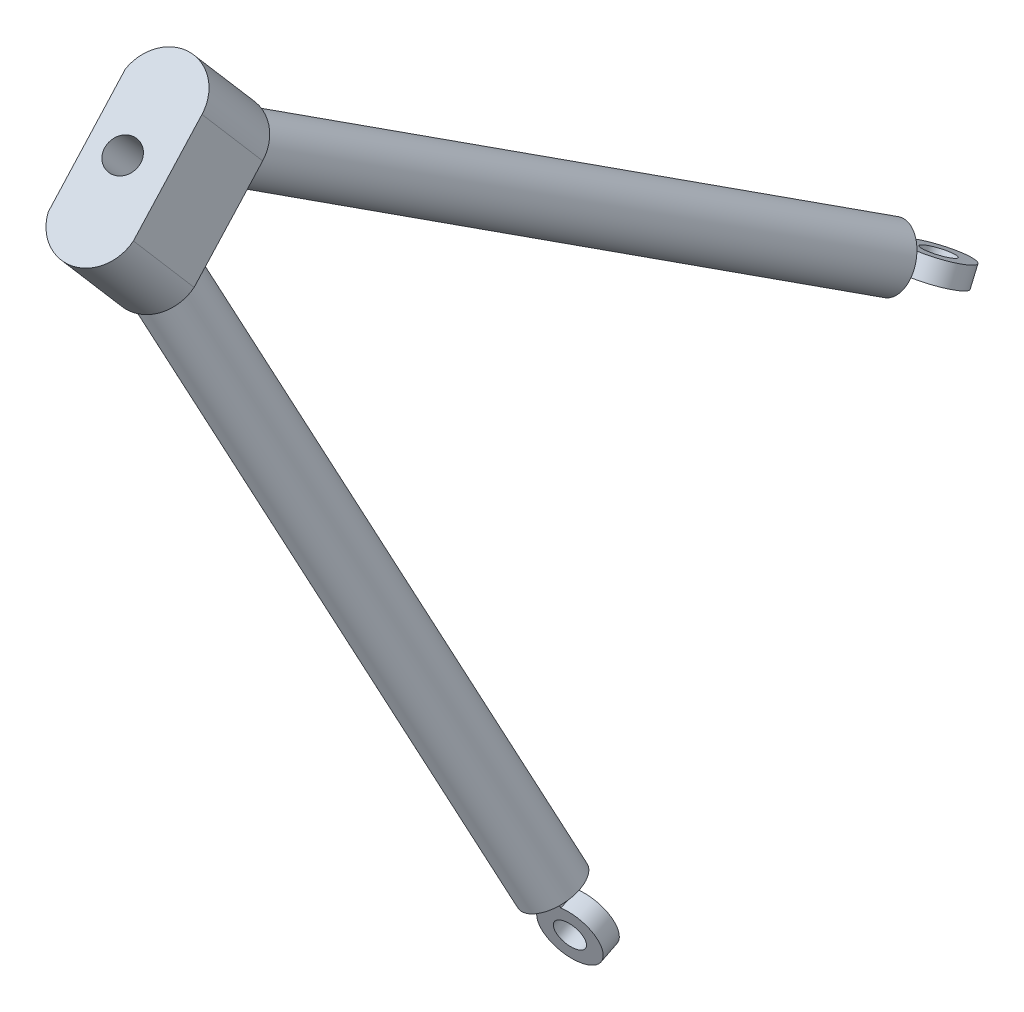
ISO-10303-21;
HEADER;
FILE_DESCRIPTION(('STEP AP214'),'2;1');
FILE_NAME('part.step','',(''),(''),'','','');
FILE_SCHEMA(('AUTOMOTIVE_DESIGN { 1 0 10303 214 1 1 1 1 }'));
ENDSEC;
DATA;
#1=APPLICATION_CONTEXT('core data for automotive mechanical design processes');
#2=APPLICATION_PROTOCOL_DEFINITION('international standard','automotive_design',2000,#1);
#3=PRODUCT_CONTEXT('',#1,'mechanical');
#4=PRODUCT('Part','Part','',(#3));
#5=PRODUCT_RELATED_PRODUCT_CATEGORY('part','',(#4));
#6=PRODUCT_DEFINITION_FORMATION('','',#4);
#7=PRODUCT_DEFINITION_CONTEXT('part definition',#1,'design');
#8=PRODUCT_DEFINITION('design','',#6,#7);
#9=PRODUCT_DEFINITION_SHAPE('','',#8);
#10=(LENGTH_UNIT() NAMED_UNIT(*) SI_UNIT(.MILLI.,.METRE.));
#11=(NAMED_UNIT(*) PLANE_ANGLE_UNIT() SI_UNIT($,.RADIAN.));
#12=(NAMED_UNIT(*) SI_UNIT($,.STERADIAN.) SOLID_ANGLE_UNIT());
#13=UNCERTAINTY_MEASURE_WITH_UNIT(LENGTH_MEASURE(1.E-05),#10,'distance_accuracy_value','');
#14=(GEOMETRIC_REPRESENTATION_CONTEXT(3) GLOBAL_UNCERTAINTY_ASSIGNED_CONTEXT((#13)) GLOBAL_UNIT_ASSIGNED_CONTEXT((#10,
#11,#12)) REPRESENTATION_CONTEXT('',''));
#15=CARTESIAN_POINT('',(0.,0.,0.));
#16=DIRECTION('',(0.,0.,1.));
#17=DIRECTION('',(1.,0.,0.));
#18=AXIS2_PLACEMENT_3D('',#15,#16,#17);
#19=CARTESIAN_POINT('',(64.1066183327884,286.099935377502,168.11116611111));
#20=DIRECTION('',(-0.037673906148432,-0.778948907408393,-0.625954692004773));
#21=DIRECTION('',(0.,0.626399381438984,-0.779502286675837));
#22=AXIS2_PLACEMENT_3D('',#19,#20,#21);
#23=PLANE('',#22);
#24=CARTESIAN_POINT('',(-121.852419430735,339.457254108478,112.90457970323));
#25=DIRECTION('',(-0.037673906148432,-0.778948907408393,-0.625954692004773));
#26=DIRECTION('',(-0.993413930876286,-0.0386367224667163,0.107870133113649));
#27=AXIS2_PLACEMENT_3D('',#24,#25,#26);
#28=ELLIPSE('',#27,8.43593846476446,8.00000000000001);
#29=CARTESIAN_POINT('',(-130.232798221647,339.131317095268,113.814565508363));
#30=VERTEX_POINT('',#29);
#31=EDGE_CURVE('E182',#30,#30,#28,.T.);
#32=ORIENTED_EDGE('',*,*,#31,.T.);
#33=EDGE_LOOP('',(#32));
#34=FACE_BOUND('',#33,.T.);
#35=DIRECTION('',(0.1082101600426,-0.62589600040606,0.772363099804265));
#36=VECTOR('',#35,1.);
#37=CARTESIAN_POINT('',(-148.451309490906,396.444612421055,43.5894088768372));
#38=LINE('',#37,#36);
#39=CARTESIAN_POINT('',(-141.725842387964,357.54398646378,91.5932434263382));
#40=VERTEX_POINT('',#39);
#41=CARTESIAN_POINT('',(-135.248163738386,320.076588235273,137.828457932577));
#42=VERTEX_POINT('',#41);
#43=EDGE_CURVE('E292',#40,#42,#38,.T.);
#44=ORIENTED_EDGE('',*,*,#43,.T.);
#45=CARTESIAN_POINT('',(-97.3381940576362,323.025360728805,131.877292777245));
#46=CARTESIAN_POINT('',(-97.3381937393744,322.855899519819,132.088173234382));
#47=CARTESIAN_POINT('',(-97.3438139305175,322.686621775132,132.299163663103));
#48=CARTESIAN_POINT('',(-97.366279465957,322.348694154114,132.721038790843));
#49=CARTESIAN_POINT('',(-97.3831244578764,322.180044258239,132.931923492974));
#50=CARTESIAN_POINT('',(-97.4504624258511,321.675493761683,133.563847731842));
#51=CARTESIAN_POINT('',(-97.5177584105921,321.340909510328,133.984260491748));
#52=CARTESIAN_POINT('',(-97.696718273175,320.677702676251,134.820337547391));
#53=CARTESIAN_POINT('',(-97.8083833724261,320.349080257909,135.236001712083));
#54=CARTESIAN_POINT('',(-98.0085155166511,319.862415644835,135.853660838511));
#55=CARTESIAN_POINT('',(-98.080668844742,319.701232635498,136.058582422078));
#56=CARTESIAN_POINT('',(-98.235753396477,319.381162487171,136.466217250028));
#57=CARTESIAN_POINT('',(-98.3186873001898,319.222275930034,136.668929931647));
#58=CARTESIAN_POINT('',(-98.5834034146772,318.749591008868,137.27307955745));
#59=CARTESIAN_POINT('',(-98.7811448469471,318.439658465263,137.670666334179));
#60=CARTESIAN_POINT('',(-99.2177842181535,317.832390328204,138.452641082207));
#61=CARTESIAN_POINT('',(-99.4566821580555,317.535054735047,138.837029053195));
#62=CARTESIAN_POINT('',(-99.8445973545878,317.100075558855,139.401671892785));
#63=CARTESIAN_POINT('',(-99.9788559838456,316.956896302825,139.587927181762));
#64=CARTESIAN_POINT('',(-100.256972869585,316.6744803494,139.956109337357));
#65=CARTESIAN_POINT('',(-100.400828727979,316.535242679402,140.138037269965));
#66=CARTESIAN_POINT('',(-100.846508074405,316.123730775573,140.676953638916));
#67=CARTESIAN_POINT('',(-101.162468123967,315.857629858021,141.027110720636));
#68=CARTESIAN_POINT('',(-101.829738613724,315.343899528108,141.706566231438));
#69=CARTESIAN_POINT('',(-102.181049099533,315.096270139581,142.035864633605));
#70=CARTESIAN_POINT('',(-102.916638965089,314.621147625528,142.671387798216));
#71=CARTESIAN_POINT('',(-103.300918393683,314.393654529835,142.977612526473));
#72=CARTESIAN_POINT('',(-104.099779146479,313.960388726496,143.564856513698));
#73=CARTESIAN_POINT('',(-104.514360455677,313.754616008093,143.845875785148));
#74=CARTESIAN_POINT('',(-105.370964524748,313.366208971872,144.38077209965));
#75=CARTESIAN_POINT('',(-105.812987271141,313.183574642686,144.634649156037));
#76=CARTESIAN_POINT('',(-106.721420443941,312.842706620628,145.113506497112));
#77=CARTESIAN_POINT('',(-107.187830874477,312.684472931888,145.338486776906));
#78=CARTESIAN_POINT('',(-108.141818030109,312.393498932255,145.757996854905));
#79=CARTESIAN_POINT('',(-108.629394758435,312.260758625252,145.952526648463));
#80=CARTESIAN_POINT('',(-109.622346530586,312.021688361731,146.309791951038));
#81=CARTESIAN_POINT('',(-110.127721573427,311.915358403755,146.472527461811));
#82=CARTESIAN_POINT('',(-111.152779234605,311.729843265186,146.765080170432));
#83=CARTESIAN_POINT('',(-111.67246185234,311.650658083452,146.894897369663));
#84=CARTESIAN_POINT('',(-112.722545104743,311.5199794474,147.120716778766));
#85=CARTESIAN_POINT('',(-113.252945739657,311.468485993715,147.216718987863));
#86=CARTESIAN_POINT('',(-114.320801395158,311.393546494499,147.374245300935));
#87=CARTESIAN_POINT('',(-114.858256415719,311.370100448862,147.43576940504));
#88=CARTESIAN_POINT('',(-115.936508481097,311.351417714111,147.523914543405));
#89=CARTESIAN_POINT('',(-116.477305525804,311.356181024073,147.550535578809));
#90=CARTESIAN_POINT('',(-117.558506265147,311.393884098147,147.568690705643));
#91=CARTESIAN_POINT('',(-118.098909959756,311.426823864213,147.56022479464));
#92=CARTESIAN_POINT('',(-119.175591310538,311.520652334713,147.508264496499));
#93=CARTESIAN_POINT('',(-119.711868966236,311.581541042373,147.46477010532));
#94=CARTESIAN_POINT('',(-120.776593802281,311.730846800189,147.343053287239));
#95=CARTESIAN_POINT('',(-121.305040984977,311.819263842083,147.264830870761));
#96=CARTESIAN_POINT('',(-122.350454678671,312.023015507611,147.074198351528));
#97=CARTESIAN_POINT('',(-122.86742119483,312.138350119137,146.961788264149));
#98=CARTESIAN_POINT('',(-123.886303594109,312.395140456642,146.703556678045));
#99=CARTESIAN_POINT('',(-124.388219459171,312.536596213956,146.557735139238));
#100=CARTESIAN_POINT('',(-125.373533874269,312.844651931977,146.233687688579));
#101=CARTESIAN_POINT('',(-125.856932392464,313.011251935919,146.055461721009));
#102=CARTESIAN_POINT('',(-126.801870073014,313.368444424818,145.667837491062));
#103=CARTESIAN_POINT('',(-127.263409336755,313.559036798482,145.458439373285));
#104=CARTESIAN_POINT('',(-128.16143991183,313.962896718961,145.00991821387));
#105=CARTESIAN_POINT('',(-128.597931383386,314.176164120706,144.770795362403));
#106=CARTESIAN_POINT('',(-129.442862613898,314.623906510955,144.264470240388));
#107=CARTESIAN_POINT('',(-129.851301883685,314.858381869116,143.997267480393));
#108=CARTESIAN_POINT('',(-130.637306035683,315.346920911401,143.436627691216));
#109=CARTESIAN_POINT('',(-131.01487020312,315.600985048752,143.143190055013));
#110=CARTESIAN_POINT('',(-131.736490652106,316.126933132115,142.532122786559));
#111=CARTESIAN_POINT('',(-132.08054906723,316.398815941626,142.214494697002));
#112=CARTESIAN_POINT('',(-132.706005771907,316.935533846368,141.584237534092));
#113=CARTESIAN_POINT('',(-132.99022933888,317.199115104291,141.27333880073));
#114=CARTESIAN_POINT('',(-133.526805798785,317.738168798689,140.634825566149));
#115=CARTESIAN_POINT('',(-133.779160339465,318.013640619387,140.307211930383));
#116=CARTESIAN_POINT('',(-134.256242670922,318.58168933244,139.629036057864));
#117=CARTESIAN_POINT('',(-134.480152841154,318.874518959619,139.278110103935));
#118=CARTESIAN_POINT('',(-134.891705038304,319.469226650256,138.562815318676));
#119=CARTESIAN_POINT('',(-135.079342050916,319.771105958068,138.198444637062));
#120=CARTESIAN_POINT('',(-135.248163738386,320.076588235273,137.828457932577));
#121=B_SPLINE_CURVE_WITH_KNOTS('',3,(#45,#46,#47,#48,#49,#50,#51,#52,#53,#54,#55,#56,#57,#58,
#59,#60,#61,#62,#63,#64,#65,#66,#67,#68,#69,#70,#71,#72,#73,#74,#75,#76,#77,#78,#79,#80,#81,#82,
#83,#84,#85,#86,#87,#88,#89,#90,#91,#92,#93,#94,#95,#96,#97,#98,#99,#100,#101,#102,#103,#104,
#105,#106,#107,#108,#109,#110,#111,#112,#113,#114,#115,#116,#117,#118,#119,#120),.UNSPECIFIED.,
.F.,.F.,(4,2,2,2,2,2,2,2,2,2,2,2,2,2,2,2,2,2,2,2,2,2,2,2,2,2,2,2,2,2,2,2,2,2,2,2,2,4),(0.,
0.811479840424231,1.62293420749176,3.2454474393437,4.86800533942901,5.67934905032962,
6.49089484972109,8.11344329126245,9.73599177087325,10.5475439131544,11.3588940246167,
12.9814391895078,14.6039864480804,16.22653611066,17.8490849697867,19.4716330318122,
21.0941813686048,22.7167299529644,24.3392784476407,25.9618268741166,27.5843753377637,
29.2069237952688,30.8294721996098,32.452020716421,34.0745694204767,35.6971176375732,
37.3196651249156,38.9422145587254,40.5647667824482,42.1873114798776,43.8098457972847,
45.4324084010295,47.0550085572879,48.6775053221789,50.1668014450953,51.6560205342421,
53.1813259739252,54.7068421173333),.UNSPECIFIED.);
#122=CARTESIAN_POINT('',(-97.3381940576363,323.025360728805,131.877292777245));
#123=VERTEX_POINT('',#122);
#124=EDGE_CURVE('E235',#123,#42,#121,.T.);
#125=ORIENTED_EDGE('',*,*,#124,.F.);
#126=DIRECTION('',(0.10606002987868,-0.625978149610805,0.772594736114586));
#127=VECTOR('',#126,1.);
#128=CARTESIAN_POINT('',(-90.1015643399452,280.313963369398,184.59255255507));
#129=LINE('',#128,#127);
#130=CARTESIAN_POINT('',(-102.962147222472,356.218560840557,90.9095821677259));
#131=VERTEX_POINT('',#130);
#132=EDGE_CURVE('E242',#131,#123,#129,.T.);
#133=ORIENTED_EDGE('',*,*,#132,.F.);
#134=CARTESIAN_POINT('',(-141.725842387964,357.54398646378,91.5932434263381));
#135=CARTESIAN_POINT('',(-141.693032820285,357.711230799745,91.3831469784264));
#136=CARTESIAN_POINT('',(-141.654647841175,357.877865533656,91.1734735664486));
#137=CARTESIAN_POINT('',(-141.566793398876,358.209659512422,90.75529573249));
#138=CARTESIAN_POINT('',(-141.517324282405,358.374818803263,90.5467912741528));
#139=CARTESIAN_POINT('',(-141.352413410882,358.867634705972,89.9235972145063));
#140=CARTESIAN_POINT('',(-141.22045208424,359.192711073304,89.5111242622451));
#141=CARTESIAN_POINT('',(-140.913391487326,359.833597217336,88.6951135504463));
#142=CARTESIAN_POINT('',(-140.738291024644,360.14940673762,88.2915760382294));
#143=CARTESIAN_POINT('',(-140.444274456393,360.614446461113,87.6951767430678));
#144=CARTESIAN_POINT('',(-140.341036451104,360.768020012471,87.4978536292121));
#145=CARTESIAN_POINT('',(-140.124246745589,361.072078193896,87.1064305655962));
#146=CARTESIAN_POINT('',(-140.010692521992,361.222562057123,86.9123314182336));
#147=CARTESIAN_POINT('',(-139.654908600012,361.668879312489,86.3355131386951));
#148=CARTESIAN_POINT('',(-139.397490194183,361.959685029351,85.9581363807652));
#149=CARTESIAN_POINT('',(-138.844043190303,362.525700116563,85.2204674246246));
#150=CARTESIAN_POINT('',(-138.548013790116,362.800909162725,84.8601755815611));
#151=CARTESIAN_POINT('',(-137.919361454413,363.333870982896,84.1591123541208));
#152=CARTESIAN_POINT('',(-137.586738664322,363.591623826271,83.8183408921772));
#153=CARTESIAN_POINT('',(-136.887204751134,364.087879664003,83.1586891268605));
#154=CARTESIAN_POINT('',(-136.520294068007,364.326382905291,82.8398085426827));
#155=CARTESIAN_POINT('',(-135.754725877029,364.782495699264,82.226137119488));
#156=CARTESIAN_POINT('',(-135.356067852233,365.000104911604,81.9313466728918));
#157=CARTESIAN_POINT('',(-134.529699729226,365.412944673613,81.3678656395719));
#158=CARTESIAN_POINT('',(-134.10199020473,365.608175665009,81.0991745376863));
#159=CARTESIAN_POINT('',(-133.440955197816,365.883193586247,80.7171521914497));
#160=CARTESIAN_POINT('',(-133.217314132579,365.971912216886,80.593289052638));
#161=CARTESIAN_POINT('',(-132.763965454733,366.143241497414,80.3527985293807));
#162=CARTESIAN_POINT('',(-132.534259364373,366.225853660542,80.2361693534526));
#163=CARTESIAN_POINT('',(-131.836588463581,366.464326949685,79.8974188036582));
#164=CARTESIAN_POINT('',(-131.35995401442,366.610873541883,79.6863668040973));
#165=CARTESIAN_POINT('',(-130.387250057035,366.87797302084,79.2954400996099));
#166=CARTESIAN_POINT('',(-129.891185831899,366.998532916369,79.1155569908185));
#167=CARTESIAN_POINT('',(-128.882518523545,367.212979203257,78.7879883328973));
#168=CARTESIAN_POINT('',(-128.369903894983,367.306846506094,78.6403258429859));
#169=CARTESIAN_POINT('',(-127.325059630097,367.468205939984,78.3766420307042));
#170=CARTESIAN_POINT('',(-126.792660064343,367.535331993638,78.2610660339899));
#171=CARTESIAN_POINT('',(-125.987216546278,367.614531295223,78.1140323682627));
#172=CARTESIAN_POINT('',(-125.717530904726,367.63735225013,78.0694021900773));
#173=CARTESIAN_POINT('',(-125.176262203757,367.675798537942,77.9889819923075));
#174=CARTESIAN_POINT('',(-124.904678675808,367.691422025355,77.9531942410851));
#175=CARTESIAN_POINT('',(-124.087335473117,367.727459445146,77.859155773712));
#176=CARTESIAN_POINT('',(-123.539460635979,367.73699340978,77.8143169748513));
#177=CARTESIAN_POINT('',(-122.442213751397,367.726964495089,77.760757884332));
#178=CARTESIAN_POINT('',(-121.892841703476,367.707401606503,77.7520376041678));
#179=CARTESIAN_POINT('',(-121.070836931214,367.656370753343,77.7660678475417));
#180=CARTESIAN_POINT('',(-120.797207668773,367.635749523944,77.7752605271876));
#181=CARTESIAN_POINT('',(-120.251109973898,367.587326190036,77.802651758462));
#182=CARTESIAN_POINT('',(-119.978641261732,367.559525928643,77.8208479996483));
#183=CARTESIAN_POINT('',(-119.16353590967,367.465405701693,77.8889146599952));
#184=CARTESIAN_POINT('',(-118.623160823522,367.388363854844,77.9522636893322));
#185=CARTESIAN_POINT('',(-117.552790572083,367.206293178691,78.1144139649989));
#186=CARTESIAN_POINT('',(-117.022792235776,367.101273047187,78.2132041967841));
#187=CARTESIAN_POINT('',(-115.976681665415,366.863974005954,78.4455417114737));
#188=CARTESIAN_POINT('',(-115.460569352681,366.731695250716,78.5790887973918));
#189=CARTESIAN_POINT('',(-114.445835592624,366.44079659214,78.8800150628683));
#190=CARTESIAN_POINT('',(-113.947217073798,366.28217230375,79.0473998755168));
#191=CARTESIAN_POINT('',(-112.97109895308,365.939724981161,79.4147983282215));
#192=CARTESIAN_POINT('',(-112.493599391458,365.755901898914,79.6148120304936));
#193=CARTESIAN_POINT('',(-111.563129096204,365.364369316993,80.0460404081586));
#194=CARTESIAN_POINT('',(-111.110157700486,365.156660462537,80.2772542407822));
#195=CARTESIAN_POINT('',(-110.231951693171,364.718830471351,80.769241514781));
#196=CARTESIAN_POINT('',(-109.806717008507,364.488709393666,81.0300148782825));
#197=CARTESIAN_POINT('',(-108.987090042972,364.007738014297,81.5792137028435));
#198=CARTESIAN_POINT('',(-108.592691231002,363.756892125445,81.8676332794169));
#199=CARTESIAN_POINT('',(-107.837447713669,363.236222471942,82.4701083293571));
#200=CARTESIAN_POINT('',(-107.476603317339,362.966398532544,82.7841640387809));
#201=CARTESIAN_POINT('',(-106.790831827366,362.409513963193,83.435886825281));
#202=CARTESIAN_POINT('',(-106.465921312021,362.122445470837,83.7735646842538));
#203=CARTESIAN_POINT('',(-106.007494488567,361.680663334138,84.295735038988));
#204=CARTESIAN_POINT('',(-105.859504946003,361.531535032239,84.4724059468077));
#205=CARTESIAN_POINT('',(-105.57335387551,361.229747375181,84.8307333785306));
#206=CARTESIAN_POINT('',(-105.435194899025,361.077087116856,85.0123911799104));
#207=CARTESIAN_POINT('',(-105.035740005605,360.614075685732,85.5645289410627));
#208=CARTESIAN_POINT('',(-104.789607587,360.298830208971,85.9420120929069));
#209=CARTESIAN_POINT('',(-104.339672295354,359.657670448074,86.7128025054361));
#210=CARTESIAN_POINT('',(-104.135868980258,359.331756275395,87.1061096008158));
#211=CARTESIAN_POINT('',(-103.863159314301,358.836963634718,87.7054247801404));
#212=CARTESIAN_POINT('',(-103.777803330091,358.671163462941,87.9066121359086));
#213=CARTESIAN_POINT('',(-103.618157951845,358.337822555748,88.311818892397));
#214=CARTESIAN_POINT('',(-103.543866101919,358.170282215452,88.5158376536101));
#215=CARTESIAN_POINT('',(-103.33783318948,357.665573381053,89.131505744976));
#216=CARTESIAN_POINT('',(-103.22280723113,357.326085604051,89.5470472516323));
#217=CARTESIAN_POINT('',(-103.096120104443,356.85755381772,90.1224715255105));
#218=CARTESIAN_POINT('',(-103.064847782668,356.729910915133,90.2794304080755));
#219=CARTESIAN_POINT('',(-103.008709414533,356.47441167777,90.5939993420425));
#220=CARTESIAN_POINT('',(-102.983835741332,356.346555781633,90.7516083885621));
#221=CARTESIAN_POINT('',(-102.962147222472,356.218560840557,90.9095821677259));
#222=B_SPLINE_CURVE_WITH_KNOTS('',3,(#134,#135,#136,#137,#138,#139,#140,#141,#142,#143,#144,
#145,#146,#147,#148,#149,#150,#151,#152,#153,#154,#155,#156,#157,#158,#159,#160,#161,#162,#163,
#164,#165,#166,#167,#168,#169,#170,#171,#172,#173,#174,#175,#176,#177,#178,#179,#180,#181,#182,
#183,#184,#185,#186,#187,#188,#189,#190,#191,#192,#193,#194,#195,#196,#197,#198,#199,#200,#201,
#202,#203,#204,#205,#206,#207,#208,#209,#210,#211,#212,#213,#214,#215,#216,#217,#218,#219,#220,
#221),.UNSPECIFIED.,.F.,.F.,(4,2,2,2,2,2,2,2,2,2,2,2,2,2,2,2,2,2,2,2,2,2,2,2,2,2,2,2,2,2,2,2,2,
2,2,2,2,2,2,2,2,2,2,4),(0.,0.811479732321553,1.62293408465598,3.24544743926404,4.86800564683115,
5.67935075106239,6.49089484944223,8.11342645347943,9.73599177059413,11.3585506397811,
12.9810886917462,14.6036531690723,16.2261856128981,17.0378062308267,17.8492250426372,
19.4716331204031,21.0936030758556,22.7167300411985,24.3613705691171,25.1840751413354,
26.0069905446597,27.6542794104329,29.3015688004327,30.1250315962616,30.9482831893043,
32.5946688175834,34.2405432188336,35.8864082922118,37.532547584738,39.1786900161228,
40.8247879912612,42.4708816299077,44.1166256728913,45.7623848715718,47.4089002107178,
48.2322042475454,49.055721192643,50.703514966329,52.3512915307666,53.1740338547755,
53.9965932827499,55.6405597367136,56.2546239585575,56.8679528219215),.UNSPECIFIED.);
#223=EDGE_CURVE('E228',#40,#131,#222,.T.);
#224=ORIENTED_EDGE('',*,*,#223,.F.);
#225=EDGE_LOOP('',(#44,#125,#133,#224));
#226=FACE_BOUND('',#225,.T.);
#227=ADVANCED_FACE('F34',(#34,#226),#23,.F.);
#228=CARTESIAN_POINT('',(-87.6526310850687,309.688035716954,83.9891650460086));
#229=DIRECTION('',(-0.0376739061484321,-0.778948907408392,-0.625954692004774));
#230=DIRECTION('',(0.,0.626399381438985,-0.779502286675836));
#231=AXIS2_PLACEMENT_3D('',#228,#229,#230);
#232=PLANE('',#231);
#233=CARTESIAN_POINT('',(-116.861333492518,324.605257098523,67.1838794272751));
#234=DIRECTION('',(-0.0376739061484321,-0.778948907408392,-0.625954692004774));
#235=DIRECTION('',(-0.618339705609189,-0.473905891010693,0.626952322694878));
#236=AXIS2_PLACEMENT_3D('',#233,#234,#235);
#237=ELLIPSE('',#236,17.080853722299,15.);
#238=CARTESIAN_POINT('',(-127.423103554718,316.510539896033,77.8927603420819));
#239=VERTEX_POINT('',#238);
#240=EDGE_CURVE('E177',#239,#239,#237,.F.);
#241=ORIENTED_EDGE('',*,*,#240,.T.);
#242=EDGE_LOOP('',(#241));
#243=FACE_BOUND('',#242,.T.);
#244=CARTESIAN_POINT('',(-111.34757350784,292.713239562923,106.539007925983));
#245=DIRECTION('',(-0.0376739061484321,-0.778948907408392,-0.625954692004774));
#246=DIRECTION('',(-0.772850829500835,0.419798493346211,-0.475889504322298));
#247=AXIS2_PLACEMENT_3D('',#244,#245,#246);
#248=ELLIPSE('',#247,17.080853722299,15.);
#249=CARTESIAN_POINT('',(-124.548525475702,299.883756220611,98.4104089146768));
#250=VERTEX_POINT('',#249);
#251=EDGE_CURVE('E147',#250,#250,#248,.F.);
#252=ORIENTED_EDGE('',*,*,#251,.T.);
#253=EDGE_LOOP('',(#252));
#254=FACE_BOUND('',#253,.T.);
#255=CARTESIAN_POINT('',(-111.34757350784,292.713239562923,106.539007925983));
#256=DIRECTION('',(-0.0376739061484321,-0.778948907408392,-0.625954692004774));
#257=DIRECTION('',(0.,0.626399381438985,-0.779502286675836));
#258=AXIS2_PLACEMENT_3D('',#255,#256,#257);
#259=CIRCLE('',#258,19.522909944376);
#260=CARTESIAN_POINT('',(-91.8385231425678,292.13991229715,106.078288501832));
#261=VERTEX_POINT('',#260);
#262=CARTESIAN_POINT('',(-129.748492823317,289.191139803618,112.029453657164));
#263=VERTEX_POINT('',#262);
#264=EDGE_CURVE('E259',#261,#263,#259,.T.);
#265=ORIENTED_EDGE('',*,*,#264,.T.);
#266=DIRECTION('',(0.1082101600426,-0.625896000406059,0.772363099804265));
#267=VECTOR('',#266,1.);
#268=CARTESIAN_POINT('',(-132.987332148107,307.924838917872,88.9118464040439));
#269=LINE('',#268,#267);
#270=CARTESIAN_POINT('',(-136.226171472895,326.658538032125,65.7942391509254));
#271=VERTEX_POINT('',#270);
#272=EDGE_CURVE('E184',#271,#263,#269,.T.);
#273=ORIENTED_EDGE('',*,*,#272,.F.);
#274=CARTESIAN_POINT('',(-116.861333492518,324.605257098523,67.1838794272751));
#275=DIRECTION('',(-0.0376739061484321,-0.778948907408392,-0.625954692004774));
#276=DIRECTION('',(0.,0.626399381438985,-0.779502286675836));
#277=AXIS2_PLACEMENT_3D('',#274,#275,#276);
#278=CIRCLE('',#277,19.522909944376);
#279=CARTESIAN_POINT('',(-97.462476307403,325.333112408902,65.110577892313));
#280=VERTEX_POINT('',#279);
#281=EDGE_CURVE('E49',#271,#280,#278,.T.);
#282=ORIENTED_EDGE('',*,*,#281,.T.);
#283=DIRECTION('',(0.10606002987868,-0.625978149610806,0.772594736114585));
#284=VECTOR('',#283,1.);
#285=CARTESIAN_POINT('',(-97.462476307403,325.333112408902,65.1105778923131));
#286=LINE('',#285,#284);
#287=EDGE_CURVE('E263',#280,#261,#286,.T.);
#288=ORIENTED_EDGE('',*,*,#287,.T.);
#289=EDGE_LOOP('',(#265,#273,#282,#288));
#290=FACE_BOUND('',#289,.T.);
#291=ADVANCED_FACE('F192',(#243,#254,#290),#232,.T.);
#292=CARTESIAN_POINT('',(-169.350067486112,517.324657672852,-105.578002952903));
#293=DIRECTION('',(0.98486374622557,0.173312802103317,0.00246454815991584));
#294=DIRECTION('',(-0.17331332845649,0.984866737269227,0.));
#295=AXIS2_PLACEMENT_3D('',#292,#293,#294);
#296=PLANE('',#295);
#297=DIRECTION('',(0.13540296390438,-0.760405726768805,-0.635176485760544));
#298=VECTOR('',#297,1.);
#299=CARTESIAN_POINT('',(-142.29095310518,359.627992521505,170.866244336652));
#300=LINE('',#299,#298);
#301=EDGE_CURVE('E11',#42,#263,#300,.T.);
#302=ORIENTED_EDGE('',*,*,#301,.F.);
#303=ORIENTED_EDGE('',*,*,#43,.F.);
#304=DIRECTION('',(0.13540296390438,-0.760405726768805,-0.635176485760544));
#305=VECTOR('',#304,1.);
#306=CARTESIAN_POINT('',(-148.768631754758,397.095390750012,124.631029830414));
#307=LINE('',#306,#305);
#308=EDGE_CURVE('E42',#271,#40,#307,.F.);
#309=ORIENTED_EDGE('',*,*,#308,.F.);
#310=ORIENTED_EDGE('',*,*,#272,.T.);
#311=EDGE_LOOP('',(#302,#303,#309,#310));
#312=FACE_BOUND('',#311,.T.);
#313=ADVANCED_FACE('F201',(#312),#296,.F.);
#314=CARTESIAN_POINT('',(-42.3678561084588,296.458341491286,-283.995568857684));
#315=DIRECTION('',(0.087198264057115,-0.865660711655508,0.492978696336368));
#316=DIRECTION('',(0.,-0.494863643313455,-0.86897064077363));
#317=AXIS2_PLACEMENT_3D('',#314,#315,#316);
#318=CYLINDRICAL_SURFACE('',#317,7.50000000000001);
#319=CARTESIAN_POINT('',(-29.526812531876,168.978889450554,-211.398241486168));
#320=DIRECTION('',(0.087198264057115,-0.865660711655508,0.492978696336368));
#321=DIRECTION('',(0.,-0.494863643313455,-0.86897064077363));
#322=AXIS2_PLACEMENT_3D('',#319,#320,#321);
#323=CIRCLE('',#322,7.50000000000001);
#324=CARTESIAN_POINT('',(-29.526812531876,165.267412125703,-217.91552129197));
#325=VERTEX_POINT('',#324);
#326=EDGE_CURVE('E172',#325,#325,#323,.F.);
#327=ORIENTED_EDGE('',*,*,#326,.F.);
#328=EDGE_LOOP('',(#327));
#329=FACE_BOUND('',#328,.T.);
#330=CARTESIAN_POINT('',(-30.3987951724471,177.635496567109,-216.328028449532));
#331=DIRECTION('',(0.087198264057115,-0.865660711655508,0.492978696336368));
#332=DIRECTION('',(0.,-0.494863643313455,-0.86897064077363));
#333=AXIS2_PLACEMENT_3D('',#330,#331,#332);
#334=CIRCLE('',#333,7.50000000000001);
#335=CARTESIAN_POINT('',(-30.3987951724471,173.924019242258,-222.845308255334));
#336=VERTEX_POINT('',#335);
#337=EDGE_CURVE('E167',#336,#336,#334,.F.);
#338=ORIENTED_EDGE('',*,*,#337,.T.);
#339=EDGE_LOOP('',(#338));
#340=FACE_BOUND('',#339,.T.);
#341=ADVANCED_FACE('F36',(#329,#340),#318,.F.);
#342=CARTESIAN_POINT('',(-30.3987951724471,177.635496567109,-216.328028449532));
#343=DIRECTION('',(0.087198264057115,-0.865660711655508,0.492978696336368));
#344=DIRECTION('',(0.,-0.494863643313455,-0.86897064077363));
#345=AXIS2_PLACEMENT_3D('',#342,#343,#344);
#346=CYLINDRICAL_SURFACE('',#345,15.);
#347=CARTESIAN_POINT('',(-30.3987951724471,177.635496567109,-216.328028449532));
#348=DIRECTION('',(0.087198264057115,-0.865660711655508,0.492978696336368));
#349=DIRECTION('',(0.,-0.494863643313455,-0.86897064077363));
#350=AXIS2_PLACEMENT_3D('',#347,#348,#349);
#351=CIRCLE('',#350,15.);
#352=CARTESIAN_POINT('',(-38.9184601970362,183.085731828562,-205.250562879122));
#353=VERTEX_POINT('',#352);
#354=CARTESIAN_POINT('',(-29.3091411044778,185.121570799357,-203.37537055235));
#355=VERTEX_POINT('',#354);
#356=EDGE_CURVE('E108',#353,#355,#351,.T.);
#357=ORIENTED_EDGE('',*,*,#356,.T.);
#358=DIRECTION('',(-0.0871982640571152,0.865660711655508,-0.492978696336368));
#359=VECTOR('',#358,1.);
#360=CARTESIAN_POINT('',(-28.4371584639066,176.464963682802,-198.445583588986));
#361=LINE('',#360,#359);
#362=CARTESIAN_POINT('',(-28.4371584639066,176.464963682802,-198.445583588986));
#363=VERTEX_POINT('',#362);
#364=EDGE_CURVE('E111',#363,#355,#361,.T.);
#365=ORIENTED_EDGE('',*,*,#364,.F.);
#366=CARTESIAN_POINT('',(-29.526812531876,168.978889450554,-211.398241486168));
#367=DIRECTION('',(0.087198264057115,-0.865660711655508,0.492978696336368));
#368=DIRECTION('',(0.,-0.494863643313455,-0.86897064077363));
#369=AXIS2_PLACEMENT_3D('',#366,#367,#368);
#370=CIRCLE('',#369,15.);
#371=CARTESIAN_POINT('',(-38.046477556465,174.429124712007,-200.320775915759));
#372=VERTEX_POINT('',#371);
#373=EDGE_CURVE('E128',#372,#363,#370,.T.);
#374=ORIENTED_EDGE('',*,*,#373,.F.);
#375=DIRECTION('',(0.0871982640571152,-0.865660711655508,0.492978696336368));
#376=VECTOR('',#375,1.);
#377=CARTESIAN_POINT('',(-38.9184601970361,183.085731828562,-205.250562879122));
#378=LINE('',#377,#376);
#379=EDGE_CURVE('E114',#353,#372,#378,.T.);
#380=ORIENTED_EDGE('',*,*,#379,.F.);
#381=EDGE_LOOP('',(#357,#365,#374,#380));
#382=FACE_BOUND('',#381,.T.);
#383=ADVANCED_FACE('F110',(#382),#346,.T.);
#384=CARTESIAN_POINT('',(-40.4572658508283,185.76492924831,-200.273761356035));
#385=DIRECTION('',(-0.96093190924156,-0.203583897104336,-0.187519232723421));
#386=DIRECTION('',(0.207260505427765,-0.978285787942269,0.));
#387=AXIS2_PLACEMENT_3D('',#384,#385,#386);
#388=PLANE('',#387);
#389=ORIENTED_EDGE('',*,*,#379,.T.);
#390=DIRECTION('',(0.262690556638026,-0.457367608315118,-0.849593162824015));
#391=VECTOR('',#390,1.);
#392=CARTESIAN_POINT('',(-39.5852832098015,177.108322130962,-195.343974394145));
#393=LINE('',#392,#391);
#394=CARTESIAN_POINT('',(-39.5852832098015,177.108322130962,-195.343974394145));
#395=VERTEX_POINT('',#394);
#396=EDGE_CURVE('E171',#395,#372,#393,.T.);
#397=ORIENTED_EDGE('',*,*,#396,.F.);
#398=DIRECTION('',(0.0871982641280668,-0.865660711779042,0.492978696106896));
#399=VECTOR('',#398,1.);
#400=CARTESIAN_POINT('',(-40.4572658510535,185.764929248467,-200.273761355052));
#401=LINE('',#400,#399);
#402=CARTESIAN_POINT('',(-40.4572658510822,185.764929248752,-200.273761355214));
#403=VERTEX_POINT('',#402);
#404=EDGE_CURVE('E135',#403,#395,#401,.T.);
#405=ORIENTED_EDGE('',*,*,#404,.F.);
#406=DIRECTION('',(0.262690556638022,-0.457367608315113,-0.849593162824019));
#407=VECTOR('',#406,1.);
#408=CARTESIAN_POINT('',(-40.4572658510822,185.764929248752,-200.273761355214));
#409=LINE('',#408,#407);
#410=EDGE_CURVE('E120',#403,#353,#409,.T.);
#411=ORIENTED_EDGE('',*,*,#410,.T.);
#412=EDGE_LOOP('',(#389,#397,#405,#411));
#413=FACE_BOUND('',#412,.T.);
#414=ADVANCED_FACE('F351',(#413),#388,.T.);
#415=CARTESIAN_POINT('',(-29.526812531876,168.978889450554,-211.398241486168));
#416=DIRECTION('',(0.087198264057115,-0.865660711655508,0.492978696336368));
#417=DIRECTION('',(0.,-0.494863643313455,-0.86897064077363));
#418=AXIS2_PLACEMENT_3D('',#415,#416,#417);
#419=PLANE('',#418);
#420=ORIENTED_EDGE('',*,*,#373,.T.);
#421=DIRECTION('',(0.262690556638025,-0.457367608315121,-0.849593162824014));
#422=VECTOR('',#421,1.);
#423=CARTESIAN_POINT('',(-29.9759641178416,179.144161102798,-193.468782065437));
#424=LINE('',#423,#422);
#425=CARTESIAN_POINT('',(-29.9759641177024,179.144161102556,-193.468782065887));
#426=VERTEX_POINT('',#425);
#427=EDGE_CURVE('E127',#426,#363,#424,.T.);
#428=ORIENTED_EDGE('',*,*,#427,.F.);
#429=DIRECTION('',(0.960931909251653,0.203583897086765,0.18751923269078));
#430=VECTOR('',#429,1.);
#431=CARTESIAN_POINT('',(-39.5852832098015,177.108322130962,-195.343974394145));
#432=LINE('',#431,#430);
#433=EDGE_CURVE('E138',#395,#426,#432,.T.);
#434=ORIENTED_EDGE('',*,*,#433,.F.);
#435=ORIENTED_EDGE('',*,*,#396,.T.);
#436=EDGE_LOOP('',(#420,#428,#434,#435));
#437=FACE_BOUND('',#436,.T.);
#438=ORIENTED_EDGE('',*,*,#326,.T.);
#439=EDGE_LOOP('',(#438));
#440=FACE_BOUND('',#439,.T.);
#441=ADVANCED_FACE('F348',(#437,#440),#419,.T.);
#442=CARTESIAN_POINT('',(-30.8479467584127,187.800768219353,-198.398569028801));
#443=DIRECTION('',(0.96093190924156,0.203583897104336,0.187519232723421));
#444=DIRECTION('',(-0.207260505427766,0.97828578794227,0.));
#445=AXIS2_PLACEMENT_3D('',#442,#443,#444);
#446=PLANE('',#445);
#447=DIRECTION('',(-0.0871982641280668,0.86566071177904,-0.492978696106898));
#448=VECTOR('',#447,1.);
#449=CARTESIAN_POINT('',(-29.975964117285,179.144161101829,-193.468782067237));
#450=LINE('',#449,#448);
#451=CARTESIAN_POINT('',(-30.8479467585527,187.800768219491,-198.398569028233));
#452=VERTEX_POINT('',#451);
#453=EDGE_CURVE('E331',#426,#452,#450,.T.);
#454=ORIENTED_EDGE('',*,*,#453,.F.);
#455=ORIENTED_EDGE('',*,*,#427,.T.);
#456=ORIENTED_EDGE('',*,*,#364,.T.);
#457=DIRECTION('',(-0.262690556638024,0.457367608315117,0.849593162824016));
#458=VECTOR('',#457,1.);
#459=CARTESIAN_POINT('',(-29.3091411044778,185.121570799357,-203.37537055235));
#460=LINE('',#459,#458);
#461=EDGE_CURVE('E119',#355,#452,#460,.T.);
#462=ORIENTED_EDGE('',*,*,#461,.T.);
#463=EDGE_LOOP('',(#454,#455,#456,#462));
#464=FACE_BOUND('',#463,.T.);
#465=ADVANCED_FACE('F125',(#464),#446,.T.);
#466=CARTESIAN_POINT('',(-30.3987951724471,177.635496567109,-216.328028449532));
#467=DIRECTION('',(0.087198264057115,-0.865660711655508,0.492978696336368));
#468=DIRECTION('',(0.,-0.494863643313455,-0.86897064077363));
#469=AXIS2_PLACEMENT_3D('',#466,#467,#468);
#470=PLANE('',#469);
#471=ORIENTED_EDGE('',*,*,#461,.F.);
#472=ORIENTED_EDGE('',*,*,#356,.F.);
#473=ORIENTED_EDGE('',*,*,#410,.F.);
#474=DIRECTION('',(-0.960931909250514,-0.203583897098081,-0.187519232684333));
#475=VECTOR('',#474,1.);
#476=CARTESIAN_POINT('',(-30.8479467585484,187.800768219448,-198.398569028209));
#477=LINE('',#476,#475);
#478=EDGE_CURVE('E133',#452,#403,#477,.T.);
#479=ORIENTED_EDGE('',*,*,#478,.F.);
#480=EDGE_LOOP('',(#471,#472,#473,#479));
#481=FACE_BOUND('',#480,.T.);
#482=ORIENTED_EDGE('',*,*,#337,.F.);
#483=EDGE_LOOP('',(#482));
#484=FACE_BOUND('',#483,.T.);
#485=ADVANCED_FACE('F130',(#481,#484),#470,.F.);
#486=CARTESIAN_POINT('',(-35.2166149841836,182.454545175291,-196.871271711226));
#487=DIRECTION('',(0.262690556577552,-0.457367608089127,-0.849593162964372));
#488=DIRECTION('',(0.,0.880516795519506,-0.474014949983711));
#489=AXIS2_PLACEMENT_3D('',#486,#487,#488);
#490=PLANE('',#489);
#491=ORIENTED_EDGE('',*,*,#453,.T.);
#492=ORIENTED_EDGE('',*,*,#478,.T.);
#493=ORIENTED_EDGE('',*,*,#404,.T.);
#494=ORIENTED_EDGE('',*,*,#433,.T.);
#495=EDGE_LOOP('',(#491,#492,#493,#494));
#496=FACE_BOUND('',#495,.T.);
#497=CARTESIAN_POINT('',(-35.2166149841836,182.454545175291,-196.871271711226));
#498=DIRECTION('',(-0.262690556601101,0.45736760832294,0.849593162831221));
#499=DIRECTION('',(0.,-0.880516795387359,0.474014950229184));
#500=AXIS2_PLACEMENT_3D('',#497,#498,#499);
#501=CIRCLE('',#500,15.);
#502=CARTESIAN_POINT('',(-35.2166149841836,169.24679324448,-189.761047457788));
#503=VERTEX_POINT('',#502);
#504=EDGE_CURVE('E164',#503,#503,#501,.T.);
#505=ORIENTED_EDGE('',*,*,#504,.F.);
#506=EDGE_LOOP('',(#505));
#507=FACE_BOUND('',#506,.T.);
#508=ADVANCED_FACE('F199',(#496,#507),#490,.T.);
#509=CARTESIAN_POINT('',(-29.9628038521615,173.307193008832,-213.86313496785));
#510=DIRECTION('',(-0.262690556601101,0.45736760832294,0.849593162831221));
#511=DIRECTION('',(0.,-0.880516795387359,0.474014950229184));
#512=AXIS2_PLACEMENT_3D('',#509,#510,#511);
#513=CYLINDRICAL_SURFACE('',#512,15.);
#514=ORIENTED_EDGE('',*,*,#240,.F.);
#515=EDGE_LOOP('',(#514));
#516=FACE_BOUND('',#515,.T.);
#517=ORIENTED_EDGE('',*,*,#504,.T.);
#518=EDGE_LOOP('',(#517));
#519=FACE_BOUND('',#518,.T.);
#520=ADVANCED_FACE('F195',(#516,#519),#513,.T.);
#521=CARTESIAN_POINT('',(16.2900894177323,-42.8237876768682,134.682609022508));
#522=DIRECTION('',(-0.114507177334973,0.301019283806547,-0.946718277585983));
#523=DIRECTION('',(0.,0.952986622480446,0.303012371650583));
#524=AXIS2_PLACEMENT_3D('',#521,#522,#523);
#525=CYLINDRICAL_SURFACE('',#524,7.50000000000001);
#526=CARTESIAN_POINT('',(-0.572535886674871,1.50509641903274,-4.73359138792992));
#527=DIRECTION('',(-0.114507177334973,0.301019283806547,-0.946718277585983));
#528=DIRECTION('',(0.,0.952986622480446,0.303012371650583));
#529=AXIS2_PLACEMENT_3D('',#526,#527,#528);
#530=CIRCLE('',#529,7.50000000000001);
#531=CARTESIAN_POINT('',(-0.572535886674871,8.65249608763609,-2.46099860055055));
#532=VERTEX_POINT('',#531);
#533=EDGE_CURVE('E153',#532,#532,#530,.F.);
#534=ORIENTED_EDGE('',*,*,#533,.F.);
#535=EDGE_LOOP('',(#534));
#536=FACE_BOUND('',#535,.T.);
#537=CARTESIAN_POINT('',(0.572535886674864,-1.50509641903274,4.73359138792992));
#538=DIRECTION('',(-0.114507177334973,0.301019283806547,-0.946718277585983));
#539=DIRECTION('',(0.,0.952986622480446,0.303012371650583));
#540=AXIS2_PLACEMENT_3D('',#537,#538,#539);
#541=CIRCLE('',#540,7.50000000000001);
#542=CARTESIAN_POINT('',(0.572535886674864,5.64230324957062,7.00618417530929));
#543=VERTEX_POINT('',#542);
#544=EDGE_CURVE('E160',#543,#543,#541,.F.);
#545=ORIENTED_EDGE('',*,*,#544,.T.);
#546=EDGE_LOOP('',(#545));
#547=FACE_BOUND('',#546,.T.);
#548=ADVANCED_FACE('F198',(#536,#547),#525,.F.);
#549=CARTESIAN_POINT('',(0.572535886674867,-1.50509641903273,4.73359138792992));
#550=DIRECTION('',(-0.114507177334973,0.301019283806547,-0.946718277585983));
#551=DIRECTION('',(0.,0.952986622480447,0.303012371650583));
#552=AXIS2_PLACEMENT_3D('',#549,#550,#551);
#553=CYLINDRICAL_SURFACE('',#552,15.);
#554=DIRECTION('',(0.114507177334973,-0.301019283806547,0.946718277585983));
#555=VECTOR('',#554,1.);
#556=CARTESIAN_POINT('',(-10.006064037634,12.2411872368259,-0.178934367125913));
#557=LINE('',#556,#555);
#558=CARTESIAN_POINT('',(-10.006064037634,12.2411872368259,-0.178934367125917));
#559=VERTEX_POINT('',#558);
#560=CARTESIAN_POINT('',(-8.86099226428429,9.23099439876039,9.28824840873392));
#561=VERTEX_POINT('',#560);
#562=EDGE_CURVE('E163',#559,#561,#557,.T.);
#563=ORIENTED_EDGE('',*,*,#562,.F.);
#564=CARTESIAN_POINT('',(-0.572535886674867,1.50509641903273,-4.73359138792992));
#565=DIRECTION('',(-0.114507177334973,0.301019283806547,-0.946718277585983));
#566=DIRECTION('',(0.,0.952986622480447,0.303012371650583));
#567=AXIS2_PLACEMENT_3D('',#564,#565,#566);
#568=CIRCLE('',#567,15.);
#569=CARTESIAN_POINT('',(-0.659464463716151,15.7966163817869,-0.178934367177147));
#570=VERTEX_POINT('',#569);
#571=EDGE_CURVE('E149',#570,#559,#568,.T.);
#572=ORIENTED_EDGE('',*,*,#571,.F.);
#573=DIRECTION('',(-0.114507177334973,0.301019283806547,-0.946718277585983));
#574=VECTOR('',#573,1.);
#575=CARTESIAN_POINT('',(0.485607309633584,12.7864235437214,9.28824840868269));
#576=LINE('',#575,#574);
#577=CARTESIAN_POINT('',(0.485607309633584,12.7864235437214,9.28824840868269));
#578=VERTEX_POINT('',#577);
#579=EDGE_CURVE('E310',#578,#570,#576,.T.);
#580=ORIENTED_EDGE('',*,*,#579,.F.);
#581=CARTESIAN_POINT('',(0.572535886674867,-1.50509641903273,4.73359138792992));
#582=DIRECTION('',(-0.114507177334973,0.301019283806547,-0.946718277585983));
#583=DIRECTION('',(0.,0.952986622480447,0.303012371650583));
#584=AXIS2_PLACEMENT_3D('',#581,#582,#583);
#585=CIRCLE('',#584,15.);
#586=EDGE_CURVE('E157',#578,#561,#585,.T.);
#587=ORIENTED_EDGE('',*,*,#586,.T.);
#588=EDGE_LOOP('',(#563,#572,#580,#587));
#589=FACE_BOUND('',#588,.T.);
#590=ADVANCED_FACE('F510',(#589),#553,.T.);
#591=CARTESIAN_POINT('',(0.572535886674867,-1.50509641903273,4.73359138792992));
#592=DIRECTION('',(-0.114507177334973,0.301019283806547,-0.946718277585983));
#593=DIRECTION('',(0.,0.952986622480446,0.303012371650583));
#594=AXIS2_PLACEMENT_3D('',#591,#592,#593);
#595=PLANE('',#594);
#596=DIRECTION('',(-0.336598975668898,0.884859664971807,0.322062886537132));
#597=VECTOR('',#596,1.);
#598=CARTESIAN_POINT('',(-8.8609922642843,9.23099439876039,9.28824840873392));
#599=LINE('',#598,#597);
#600=CARTESIAN_POINT('',(-10.8327434133857,14.4143823093578,11.1748491189908));
#601=VERTEX_POINT('',#600);
#602=EDGE_CURVE('E159',#561,#601,#599,.T.);
#603=ORIENTED_EDGE('',*,*,#602,.F.);
#604=ORIENTED_EDGE('',*,*,#586,.F.);
#605=DIRECTION('',(0.336598975672771,-0.884859664981983,-0.322062886505127));
#606=VECTOR('',#605,1.);
#607=CARTESIAN_POINT('',(-1.48614383952996,17.9698114544822,11.17484911892));
#608=LINE('',#607,#606);
#609=CARTESIAN_POINT('',(-1.48614383952236,17.9698114544622,11.1748491189828));
#610=VERTEX_POINT('',#609);
#611=EDGE_CURVE('E156',#610,#578,#608,.T.);
#612=ORIENTED_EDGE('',*,*,#611,.F.);
#613=DIRECTION('',(0.934659957386427,0.355542914510192,0.));
#614=VECTOR('',#613,1.);
#615=CARTESIAN_POINT('',(-6.15944362647705,16.1920968819706,11.1748491187963));
#616=LINE('',#615,#614);
#617=EDGE_CURVE('E303',#601,#610,#616,.T.);
#618=ORIENTED_EDGE('',*,*,#617,.F.);
#619=EDGE_LOOP('',(#603,#604,#612,#618));
#620=FACE_BOUND('',#619,.T.);
#621=ORIENTED_EDGE('',*,*,#544,.F.);
#622=EDGE_LOOP('',(#621));
#623=FACE_BOUND('',#622,.T.);
#624=ADVANCED_FACE('F506',(#620,#623),#595,.F.);
#625=CARTESIAN_POINT('',(-10.8327434130463,14.4143823084656,11.1748491187963));
#626=DIRECTION('',(-0.934659957373495,-0.355542914544188,-1.23776206298332E-11));
#627=DIRECTION('',(0.355542914544188,-0.934659957373495,0.));
#628=AXIS2_PLACEMENT_3D('',#625,#626,#627);
#629=PLANE('',#628);
#630=ORIENTED_EDGE('',*,*,#562,.T.);
#631=ORIENTED_EDGE('',*,*,#602,.T.);
#632=DIRECTION('',(0.114507177244063,-0.301019283567548,0.946718277672971));
#633=VECTOR('',#632,1.);
#634=CARTESIAN_POINT('',(-11.4052792995918,15.9194787271584,6.44125773074264));
#635=LINE('',#634,#633);
#636=CARTESIAN_POINT('',(-11.9778151858122,17.4245751449962,1.70766634237776));
#637=VERTEX_POINT('',#636);
#638=EDGE_CURVE('E306',#637,#601,#635,.T.);
#639=ORIENTED_EDGE('',*,*,#638,.F.);
#640=DIRECTION('',(-0.336598975668898,0.884859664971807,0.322062886537131));
#641=VECTOR('',#640,1.);
#642=CARTESIAN_POINT('',(-10.006064037634,12.2411872368259,-0.178934367125914));
#643=LINE('',#642,#641);
#644=EDGE_CURVE('E152',#559,#637,#643,.T.);
#645=ORIENTED_EDGE('',*,*,#644,.F.);
#646=EDGE_LOOP('',(#630,#631,#639,#645));
#647=FACE_BOUND('',#646,.T.);
#648=ADVANCED_FACE('F495',(#647),#629,.T.);
#649=CARTESIAN_POINT('',(-0.572535886674867,1.50509641903273,-4.73359138792992));
#650=DIRECTION('',(-0.114507177334973,0.301019283806547,-0.946718277585983));
#651=DIRECTION('',(0.,0.952986622480446,0.303012371650583));
#652=AXIS2_PLACEMENT_3D('',#649,#650,#651);
#653=PLANE('',#652);
#654=ORIENTED_EDGE('',*,*,#571,.T.);
#655=ORIENTED_EDGE('',*,*,#644,.T.);
#656=DIRECTION('',(0.934659957386427,0.355542914510192,0.));
#657=VECTOR('',#656,1.);
#658=CARTESIAN_POINT('',(-7.30451539888003,19.2022897175471,1.70766634237779));
#659=LINE('',#658,#657);
#660=CARTESIAN_POINT('',(-2.63121561248278,20.9800042915042,1.70766634288959));
#661=VERTEX_POINT('',#660);
#662=EDGE_CURVE('E148',#661,#637,#659,.F.);
#663=ORIENTED_EDGE('',*,*,#662,.F.);
#664=DIRECTION('',(0.3365989756689,-0.884859664971807,-0.322062886537131));
#665=VECTOR('',#664,1.);
#666=CARTESIAN_POINT('',(-2.63121561266108,20.9800042919729,1.70766634306019));
#667=LINE('',#666,#665);
#668=EDGE_CURVE('E58',#661,#570,#667,.T.);
#669=ORIENTED_EDGE('',*,*,#668,.T.);
#670=EDGE_LOOP('',(#654,#655,#663,#669));
#671=FACE_BOUND('',#670,.T.);
#672=ORIENTED_EDGE('',*,*,#533,.T.);
#673=EDGE_LOOP('',(#672));
#674=FACE_BOUND('',#673,.T.);
#675=ADVANCED_FACE('F491',(#671,#674),#653,.T.);
#676=CARTESIAN_POINT('',(-1.48614383931134,17.9698114539075,11.17484911892));
#677=DIRECTION('',(0.934659957373495,0.355542914544188,1.23776856819635E-11));
#678=DIRECTION('',(-0.355542914544188,0.934659957373495,0.));
#679=AXIS2_PLACEMENT_3D('',#676,#677,#678);
#680=PLANE('',#679);
#681=DIRECTION('',(0.114507177244063,-0.301019283567548,0.946718277672971));
#682=VECTOR('',#681,1.);
#683=CARTESIAN_POINT('',(-2.0586797257276,19.4749078722603,6.44125773074264));
#684=LINE('',#683,#682);
#685=EDGE_CURVE('E300',#610,#661,#684,.F.);
#686=ORIENTED_EDGE('',*,*,#685,.F.);
#687=ORIENTED_EDGE('',*,*,#611,.T.);
#688=ORIENTED_EDGE('',*,*,#579,.T.);
#689=ORIENTED_EDGE('',*,*,#668,.F.);
#690=EDGE_LOOP('',(#686,#687,#688,#689));
#691=FACE_BOUND('',#690,.T.);
#692=ADVANCED_FACE('F486',(#691),#680,.T.);
#693=CARTESIAN_POINT('',(-6.73197951265972,17.6971932997094,6.44125773074264));
#694=DIRECTION('',(0.336598975663917,-0.884859665066771,-0.322062886281426));
#695=DIRECTION('',(0.934659957386427,0.355542914510192,0.));
#696=AXIS2_PLACEMENT_3D('',#693,#694,#695);
#697=PLANE('',#696);
#698=ORIENTED_EDGE('',*,*,#685,.T.);
#699=ORIENTED_EDGE('',*,*,#662,.T.);
#700=ORIENTED_EDGE('',*,*,#638,.T.);
#701=ORIENTED_EDGE('',*,*,#617,.T.);
#702=EDGE_LOOP('',(#698,#699,#700,#701));
#703=FACE_BOUND('',#702,.T.);
#704=CARTESIAN_POINT('',(-6.73197951303999,17.697193300709,6.44125773110648));
#705=DIRECTION('',(-0.336598975632986,0.884859664985468,0.322062886537132));
#706=DIRECTION('',(-0.934659957386429,-0.355542914510188,0.));
#707=AXIS2_PLACEMENT_3D('',#704,#705,#706);
#708=CIRCLE('',#707,15.);
#709=CARTESIAN_POINT('',(-20.7518788738364,12.3640495830562,6.44125773110648));
#710=VERTEX_POINT('',#709);
#711=EDGE_CURVE('E144',#710,#710,#708,.T.);
#712=ORIENTED_EDGE('',*,*,#711,.F.);
#713=EDGE_LOOP('',(#712));
#714=FACE_BOUND('',#713,.T.);
#715=ADVANCED_FACE('F407',(#703,#714),#697,.T.);
#716=CARTESIAN_POINT('',(0.,0.,0.));
#717=DIRECTION('',(-0.336598975632986,0.884859664985468,0.322062886537132));
#718=DIRECTION('',(-0.934659957386429,-0.355542914510188,0.));
#719=AXIS2_PLACEMENT_3D('',#716,#717,#718);
#720=CYLINDRICAL_SURFACE('',#719,15.);
#721=ORIENTED_EDGE('',*,*,#251,.F.);
#722=EDGE_LOOP('',(#721));
#723=FACE_BOUND('',#722,.T.);
#724=ORIENTED_EDGE('',*,*,#711,.T.);
#725=EDGE_LOOP('',(#724));
#726=FACE_BOUND('',#725,.T.);
#727=ADVANCED_FACE('F403',(#723,#726),#720,.T.);
#728=CARTESIAN_POINT('',(-112.157888413101,314.25952918422,91.1269960684817));
#729=DIRECTION('',(-0.279487809620156,0.726436063145482,0.627835337039435));
#730=DIRECTION('',(0.,-0.65389348913136,0.756586614256171));
#731=AXIS2_PLACEMENT_3D('',#728,#729,#730);
#732=CYLINDRICAL_SURFACE('',#731,8.00000000000001);
#733=CARTESIAN_POINT('',(-112.157888413101,314.25952918422,91.1269960684817));
#734=DIRECTION('',(-0.279487809620156,0.726436063145482,0.627835337039435));
#735=DIRECTION('',(0.,-0.65389348913136,0.756586614256171));
#736=AXIS2_PLACEMENT_3D('',#733,#734,#735);
#737=CIRCLE('',#736,8.00000000000001);
#738=CARTESIAN_POINT('',(-112.157888413101,309.028381271169,97.179688982531));
#739=VERTEX_POINT('',#738);
#740=EDGE_CURVE('E185',#739,#739,#737,.T.);
#741=ORIENTED_EDGE('',*,*,#740,.F.);
#742=EDGE_LOOP('',(#741));
#743=FACE_BOUND('',#742,.T.);
#744=ORIENTED_EDGE('',*,*,#31,.F.);
#745=EDGE_LOOP('',(#744));
#746=FACE_BOUND('',#745,.T.);
#747=ADVANCED_FACE('F406',(#743,#746),#732,.F.);
#748=CARTESIAN_POINT('',(-112.157888413101,314.25952918422,91.1269960684817));
#749=DIRECTION('',(-0.279487809620156,0.726436063145482,0.627835337039435));
#750=DIRECTION('',(0.,-0.65389348913136,0.756586614256171));
#751=AXIS2_PLACEMENT_3D('',#748,#749,#750);
#752=PLANE('',#751);
#753=ORIENTED_EDGE('',*,*,#740,.T.);
#754=EDGE_LOOP('',(#753));
#755=FACE_BOUND('',#754,.T.);
#756=ADVANCED_FACE('F255',(#755),#752,.T.);
#757=CARTESIAN_POINT('',(-110.004936589265,395.769965126789,123.947368571801));
#758=DIRECTION('',(0.985092132604746,0.17197846636854,0.00411064298592359));
#759=DIRECTION('',(-0.171979919380198,0.985100455451108,0.));
#760=AXIS2_PLACEMENT_3D('',#757,#758,#759);
#761=PLANE('',#760);
#762=ORIENTED_EDGE('',*,*,#132,.T.);
#763=DIRECTION('',(0.13540296390438,-0.760405726768805,-0.635176485760544));
#764=VECTOR('',#763,1.);
#765=CARTESIAN_POINT('',(-104.38098342443,362.576765015037,164.91507918132));
#766=LINE('',#765,#764);
#767=EDGE_CURVE('E267',#123,#261,#766,.T.);
#768=ORIENTED_EDGE('',*,*,#767,.T.);
#769=ORIENTED_EDGE('',*,*,#287,.F.);
#770=DIRECTION('',(0.13540296390438,-0.760405726768805,-0.635176485760544));
#771=VECTOR('',#770,1.);
#772=CARTESIAN_POINT('',(-110.004936589265,395.769965126789,123.947368571801));
#773=LINE('',#772,#771);
#774=EDGE_CURVE('E266',#131,#280,#773,.T.);
#775=ORIENTED_EDGE('',*,*,#774,.F.);
#776=EDGE_LOOP('',(#762,#768,#769,#775));
#777=FACE_BOUND('',#776,.T.);
#778=ADVANCED_FACE('F250',(#777),#761,.T.);
#779=CARTESIAN_POINT('',(-123.890033789703,363.15009228081,165.375798605472));
#780=DIRECTION('',(-0.0376739061484321,-0.778948907408392,-0.625954692004774));
#781=DIRECTION('',(0.,0.626399381438985,-0.779502286675836));
#782=AXIS2_PLACEMENT_3D('',#779,#780,#781);
#783=CIRCLE('',#782,19.522909944376);
#784=DIRECTION('',(0.13540296390438,-0.760405726768805,-0.635176485760544));
#785=VECTOR('',#784,1.);
#786=SURFACE_OF_LINEAR_EXTRUSION('',#783,#785);
#787=ORIENTED_EDGE('',*,*,#124,.T.);
#788=ORIENTED_EDGE('',*,*,#301,.T.);
#789=ORIENTED_EDGE('',*,*,#264,.F.);
#790=ORIENTED_EDGE('',*,*,#767,.F.);
#791=EDGE_LOOP('',(#787,#788,#789,#790));
#792=FACE_BOUND('',#791,.T.);
#793=ADVANCED_FACE('F244',(#792),#786,.T.);
#794=CARTESIAN_POINT('',(-129.40379377438,395.04210981641,126.020670106764));
#795=DIRECTION('',(-0.0376739061484321,-0.778948907408392,-0.625954692004774));
#796=DIRECTION('',(0.,0.626399381438985,-0.779502286675836));
#797=AXIS2_PLACEMENT_3D('',#794,#795,#796);
#798=CIRCLE('',#797,19.522909944376);
#799=DIRECTION('',(0.13540296390438,-0.760405726768805,-0.635176485760544));
#800=VECTOR('',#799,1.);
#801=SURFACE_OF_LINEAR_EXTRUSION('',#798,#800);
#802=ORIENTED_EDGE('',*,*,#223,.T.);
#803=ORIENTED_EDGE('',*,*,#774,.T.);
#804=ORIENTED_EDGE('',*,*,#281,.F.);
#805=ORIENTED_EDGE('',*,*,#308,.T.);
#806=EDGE_LOOP('',(#802,#803,#804,#805));
#807=FACE_BOUND('',#806,.T.);
#808=ADVANCED_FACE('F249',(#807),#801,.T.);
#809=CLOSED_SHELL('',(#227,#291,#313,#341,#383,#414,#441,#465,#485,#508,#520,#548,#590,#624,
#648,#675,#692,#715,#727,#747,#756,#778,#793,#808));
#810=MANIFOLD_SOLID_BREP('B2',#809);
#811=ADVANCED_BREP_SHAPE_REPRESENTATION('',(#18,#810),#14);
#812=SHAPE_DEFINITION_REPRESENTATION(#9,#811);
ENDSEC;
END-ISO-10303-21;
